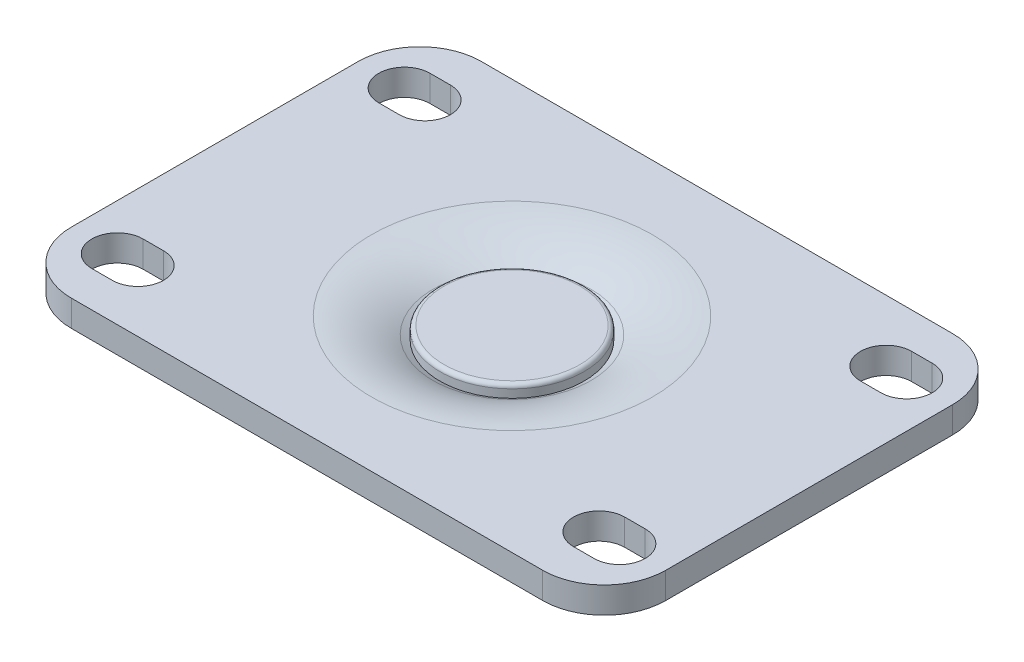
ISO-10303-21;
HEADER;
FILE_DESCRIPTION(('STEP AP214'),'2;1');
FILE_NAME('part.step','',(''),(''),'','','');
FILE_SCHEMA(('AUTOMOTIVE_DESIGN { 1 0 10303 214 1 1 1 1 }'));
ENDSEC;
DATA;
#1=APPLICATION_CONTEXT('core data for automotive mechanical design processes');
#2=APPLICATION_PROTOCOL_DEFINITION('international standard','automotive_design',2000,#1);
#3=PRODUCT_CONTEXT('',#1,'mechanical');
#4=PRODUCT('Part','Part','',(#3));
#5=PRODUCT_RELATED_PRODUCT_CATEGORY('part','',(#4));
#6=PRODUCT_DEFINITION_FORMATION('','',#4);
#7=PRODUCT_DEFINITION_CONTEXT('part definition',#1,'design');
#8=PRODUCT_DEFINITION('design','',#6,#7);
#9=PRODUCT_DEFINITION_SHAPE('','',#8);
#10=(LENGTH_UNIT() NAMED_UNIT(*) SI_UNIT(.MILLI.,.METRE.));
#11=(NAMED_UNIT(*) PLANE_ANGLE_UNIT() SI_UNIT($,.RADIAN.));
#12=(NAMED_UNIT(*) SI_UNIT($,.STERADIAN.) SOLID_ANGLE_UNIT());
#13=UNCERTAINTY_MEASURE_WITH_UNIT(LENGTH_MEASURE(1.E-05),#10,'distance_accuracy_value','');
#14=(GEOMETRIC_REPRESENTATION_CONTEXT(3) GLOBAL_UNCERTAINTY_ASSIGNED_CONTEXT((#13)) GLOBAL_UNIT_ASSIGNED_CONTEXT((#10,
#11,#12)) REPRESENTATION_CONTEXT('',''));
#15=CARTESIAN_POINT('',(0.,0.,0.));
#16=DIRECTION('',(0.,0.,1.));
#17=DIRECTION('',(1.,0.,0.));
#18=AXIS2_PLACEMENT_3D('',#15,#16,#17);
#19=CARTESIAN_POINT('',(0.,29.972,0.));
#20=DIRECTION('',(0.,-1.,0.));
#21=DIRECTION('',(0.,0.,-1.));
#22=AXIS2_PLACEMENT_3D('',#19,#20,#21);
#23=PLANE('',#22);
#24=CARTESIAN_POINT('',(0.,29.972,0.));
#25=DIRECTION('',(0.,-1.,0.));
#26=DIRECTION('',(0.,0.,-1.));
#27=AXIS2_PLACEMENT_3D('',#24,#25,#26);
#28=CIRCLE('',#27,7.747);
#29=CARTESIAN_POINT('',(0.,29.972,-7.747));
#30=VERTEX_POINT('',#29);
#31=EDGE_CURVE('E863',#30,#30,#28,.T.);
#32=ORIENTED_EDGE('',*,*,#31,.T.);
#33=EDGE_LOOP('',(#32));
#34=FACE_BOUND('',#33,.T.);
#35=CARTESIAN_POINT('',(0.,29.972,0.));
#36=DIRECTION('',(0.,1.,0.));
#37=DIRECTION('',(0.,0.,-1.));
#38=AXIS2_PLACEMENT_3D('',#35,#36,#37);
#39=CIRCLE('',#38,10.5344886859688);
#40=CARTESIAN_POINT('',(0.,29.972,-10.5344886859688));
#41=VERTEX_POINT('',#40);
#42=EDGE_CURVE('E907',#41,#41,#39,.T.);
#43=ORIENTED_EDGE('',*,*,#42,.T.);
#44=EDGE_LOOP('',(#43));
#45=FACE_BOUND('',#44,.T.);
#46=ADVANCED_FACE('F49',(#34,#45),#23,.F.);
#47=CARTESIAN_POINT('',(0.,27.051,0.));
#48=DIRECTION('',(0.,-1.,0.));
#49=DIRECTION('',(0.,0.,-1.));
#50=AXIS2_PLACEMENT_3D('',#47,#48,#49);
#51=PLANE('',#50);
#52=CARTESIAN_POINT('',(0.,27.051,0.));
#53=DIRECTION('',(0.,-1.,0.));
#54=DIRECTION('',(0.,0.,-1.));
#55=AXIS2_PLACEMENT_3D('',#52,#53,#54);
#56=CIRCLE('',#55,10.5344886859688);
#57=CARTESIAN_POINT('',(0.,27.051,-10.5344886859688));
#58=VERTEX_POINT('',#57);
#59=EDGE_CURVE('E970',#58,#58,#56,.T.);
#60=ORIENTED_EDGE('',*,*,#59,.T.);
#61=EDGE_LOOP('',(#60));
#62=FACE_BOUND('',#61,.T.);
#63=ADVANCED_FACE('F507',(#62),#51,.T.);
#64=CARTESIAN_POINT('',(0.,36.322,0.));
#65=DIRECTION('',(0.,-1.,0.));
#66=DIRECTION('',(0.,0.,-1.));
#67=AXIS2_PLACEMENT_3D('',#64,#65,#66);
#68=PLANE('',#67);
#69=CARTESIAN_POINT('',(0.,36.322,0.));
#70=DIRECTION('',(0.,-1.,0.));
#71=DIRECTION('',(0.,0.,-1.));
#72=AXIS2_PLACEMENT_3D('',#69,#70,#71);
#73=CIRCLE('',#72,7.747);
#74=CARTESIAN_POINT('',(0.,36.322,-7.747));
#75=VERTEX_POINT('',#74);
#76=EDGE_CURVE('E976',#75,#75,#73,.T.);
#77=ORIENTED_EDGE('',*,*,#76,.F.);
#78=EDGE_LOOP('',(#77));
#79=FACE_BOUND('',#78,.T.);
#80=CARTESIAN_POINT('',(0.,36.322,0.));
#81=DIRECTION('',(0.,-1.,0.));
#82=DIRECTION('',(0.,0.,-1.));
#83=AXIS2_PLACEMENT_3D('',#80,#81,#82);
#84=CIRCLE('',#83,11.1694886859688);
#85=CARTESIAN_POINT('',(0.,36.322,-11.1694886859688));
#86=VERTEX_POINT('',#85);
#87=EDGE_CURVE('E858',#86,#86,#84,.T.);
#88=ORIENTED_EDGE('',*,*,#87,.T.);
#89=EDGE_LOOP('',(#88));
#90=FACE_BOUND('',#89,.T.);
#91=ADVANCED_FACE('F511',(#79,#90),#68,.T.);
#92=CARTESIAN_POINT('',(0.,48.006,0.));
#93=DIRECTION('',(0.,-1.,0.));
#94=DIRECTION('',(0.,0.,-1.));
#95=AXIS2_PLACEMENT_3D('',#92,#93,#94);
#96=PLANE('',#95);
#97=CARTESIAN_POINT('',(0.,48.006,0.));
#98=DIRECTION('',(0.,1.,0.));
#99=DIRECTION('',(0.,0.,-1.));
#100=AXIS2_PLACEMENT_3D('',#97,#98,#99);
#101=CIRCLE('',#100,10.5344886859688);
#102=CARTESIAN_POINT('',(0.,48.006,-10.5344886859688));
#103=VERTEX_POINT('',#102);
#104=EDGE_CURVE('E960',#103,#103,#101,.T.);
#105=ORIENTED_EDGE('',*,*,#104,.T.);
#106=EDGE_LOOP('',(#105));
#107=FACE_BOUND('',#106,.T.);
#108=ADVANCED_FACE('F635',(#107),#96,.F.);
#109=CARTESIAN_POINT('',(-36.5125,49.276,22.225));
#110=DIRECTION('',(0.,-1.,0.));
#111=DIRECTION('',(0.,0.,-1.));
#112=AXIS2_PLACEMENT_3D('',#109,#110,#111);
#113=CYLINDRICAL_SURFACE('',#112,9.525);
#114=CARTESIAN_POINT('',(-36.5125,49.276,22.225));
#115=DIRECTION('',(0.,1.,0.));
#116=DIRECTION('',(0.,0.,-1.));
#117=AXIS2_PLACEMENT_3D('',#114,#115,#116);
#118=CIRCLE('',#117,9.525);
#119=CARTESIAN_POINT('',(-46.0375,49.276,22.225));
#120=VERTEX_POINT('',#119);
#121=CARTESIAN_POINT('',(-36.5125,49.276,31.75));
#122=VERTEX_POINT('',#121);
#123=EDGE_CURVE('E330',#120,#122,#118,.T.);
#124=ORIENTED_EDGE('',*,*,#123,.F.);
#125=DIRECTION('',(0.,1.,0.));
#126=VECTOR('',#125,1.);
#127=CARTESIAN_POINT('',(-46.0375,49.276,22.225));
#128=LINE('',#127,#126);
#129=CARTESIAN_POINT('',(-46.0375,45.212,22.225));
#130=VERTEX_POINT('',#129);
#131=EDGE_CURVE('E347',#130,#120,#128,.T.);
#132=ORIENTED_EDGE('',*,*,#131,.F.);
#133=CARTESIAN_POINT('',(-36.5125,45.212,22.225));
#134=DIRECTION('',(0.,-1.,0.));
#135=DIRECTION('',(0.,0.,-1.));
#136=AXIS2_PLACEMENT_3D('',#133,#134,#135);
#137=CIRCLE('',#136,9.525);
#138=CARTESIAN_POINT('',(-36.5125,45.212,31.75));
#139=VERTEX_POINT('',#138);
#140=EDGE_CURVE('E390',#139,#130,#137,.T.);
#141=ORIENTED_EDGE('',*,*,#140,.F.);
#142=DIRECTION('',(0.,-1.,0.));
#143=VECTOR('',#142,1.);
#144=CARTESIAN_POINT('',(-36.5125,49.276,31.75));
#145=LINE('',#144,#143);
#146=EDGE_CURVE('E462',#122,#139,#145,.T.);
#147=ORIENTED_EDGE('',*,*,#146,.F.);
#148=EDGE_LOOP('',(#124,#132,#141,#147));
#149=FACE_BOUND('',#148,.T.);
#150=ADVANCED_FACE('F639',(#149),#113,.T.);
#151=CARTESIAN_POINT('',(-36.5125,49.276,-22.225));
#152=DIRECTION('',(0.,-1.,0.));
#153=DIRECTION('',(0.,0.,-1.));
#154=AXIS2_PLACEMENT_3D('',#151,#152,#153);
#155=CYLINDRICAL_SURFACE('',#154,9.525);
#156=CARTESIAN_POINT('',(-36.5125,49.276,-22.225));
#157=DIRECTION('',(0.,1.,0.));
#158=DIRECTION('',(0.,0.,-1.));
#159=AXIS2_PLACEMENT_3D('',#156,#157,#158);
#160=CIRCLE('',#159,9.525);
#161=CARTESIAN_POINT('',(-36.5125,49.276,-31.75));
#162=VERTEX_POINT('',#161);
#163=CARTESIAN_POINT('',(-46.0375,49.276,-22.225));
#164=VERTEX_POINT('',#163);
#165=EDGE_CURVE('E321',#162,#164,#160,.T.);
#166=ORIENTED_EDGE('',*,*,#165,.F.);
#167=DIRECTION('',(0.,1.,0.));
#168=VECTOR('',#167,1.);
#169=CARTESIAN_POINT('',(-36.5125,49.276,-31.75));
#170=LINE('',#169,#168);
#171=CARTESIAN_POINT('',(-36.5125,45.212,-31.75));
#172=VERTEX_POINT('',#171);
#173=EDGE_CURVE('E348',#172,#162,#170,.T.);
#174=ORIENTED_EDGE('',*,*,#173,.F.);
#175=CARTESIAN_POINT('',(-36.5125,45.212,-22.225));
#176=DIRECTION('',(0.,-1.,0.));
#177=DIRECTION('',(0.,0.,-1.));
#178=AXIS2_PLACEMENT_3D('',#175,#176,#177);
#179=CIRCLE('',#178,9.525);
#180=CARTESIAN_POINT('',(-46.0375,45.212,-22.225));
#181=VERTEX_POINT('',#180);
#182=EDGE_CURVE('E389',#181,#172,#179,.T.);
#183=ORIENTED_EDGE('',*,*,#182,.F.);
#184=DIRECTION('',(0.,-1.,0.));
#185=VECTOR('',#184,1.);
#186=CARTESIAN_POINT('',(-46.0375,49.276,-22.225));
#187=LINE('',#186,#185);
#188=EDGE_CURVE('E343',#164,#181,#187,.T.);
#189=ORIENTED_EDGE('',*,*,#188,.F.);
#190=EDGE_LOOP('',(#166,#174,#183,#189));
#191=FACE_BOUND('',#190,.T.);
#192=ADVANCED_FACE('F677',(#191),#155,.T.);
#193=CARTESIAN_POINT('',(36.5125,49.276,-22.225));
#194=DIRECTION('',(0.,-1.,0.));
#195=DIRECTION('',(0.,0.,-1.));
#196=AXIS2_PLACEMENT_3D('',#193,#194,#195);
#197=CYLINDRICAL_SURFACE('',#196,9.525);
#198=CARTESIAN_POINT('',(36.5125,49.276,-22.225));
#199=DIRECTION('',(0.,1.,0.));
#200=DIRECTION('',(0.,0.,-1.));
#201=AXIS2_PLACEMENT_3D('',#198,#199,#200);
#202=CIRCLE('',#201,9.525);
#203=CARTESIAN_POINT('',(46.0375,49.276,-22.225));
#204=VERTEX_POINT('',#203);
#205=CARTESIAN_POINT('',(36.5125,49.276,-31.75));
#206=VERTEX_POINT('',#205);
#207=EDGE_CURVE('E309',#204,#206,#202,.T.);
#208=ORIENTED_EDGE('',*,*,#207,.F.);
#209=DIRECTION('',(0.,1.,0.));
#210=VECTOR('',#209,1.);
#211=CARTESIAN_POINT('',(46.0375,49.276,-22.225));
#212=LINE('',#211,#210);
#213=CARTESIAN_POINT('',(46.0375,45.212,-22.225));
#214=VERTEX_POINT('',#213);
#215=EDGE_CURVE('E458',#214,#204,#212,.T.);
#216=ORIENTED_EDGE('',*,*,#215,.F.);
#217=CARTESIAN_POINT('',(36.5125,45.212,-22.225));
#218=DIRECTION('',(0.,-1.,0.));
#219=DIRECTION('',(0.,0.,-1.));
#220=AXIS2_PLACEMENT_3D('',#217,#218,#219);
#221=CIRCLE('',#220,9.525);
#222=CARTESIAN_POINT('',(36.5125,45.212,-31.75));
#223=VERTEX_POINT('',#222);
#224=EDGE_CURVE('E402',#223,#214,#221,.T.);
#225=ORIENTED_EDGE('',*,*,#224,.F.);
#226=DIRECTION('',(0.,-1.,0.));
#227=VECTOR('',#226,1.);
#228=CARTESIAN_POINT('',(36.5125,49.276,-31.75));
#229=LINE('',#228,#227);
#230=EDGE_CURVE('E465',#206,#223,#229,.T.);
#231=ORIENTED_EDGE('',*,*,#230,.F.);
#232=EDGE_LOOP('',(#208,#216,#225,#231));
#233=FACE_BOUND('',#232,.T.);
#234=ADVANCED_FACE('F672',(#233),#197,.T.);
#235=CARTESIAN_POINT('',(36.5125,49.276,22.225));
#236=DIRECTION('',(0.,-1.,0.));
#237=DIRECTION('',(0.,0.,-1.));
#238=AXIS2_PLACEMENT_3D('',#235,#236,#237);
#239=CYLINDRICAL_SURFACE('',#238,9.525);
#240=CARTESIAN_POINT('',(36.5125,49.276,22.225));
#241=DIRECTION('',(0.,1.,0.));
#242=DIRECTION('',(0.,0.,-1.));
#243=AXIS2_PLACEMENT_3D('',#240,#241,#242);
#244=CIRCLE('',#243,9.525);
#245=CARTESIAN_POINT('',(36.5125,49.276,31.75));
#246=VERTEX_POINT('',#245);
#247=CARTESIAN_POINT('',(46.0375,49.276,22.225));
#248=VERTEX_POINT('',#247);
#249=EDGE_CURVE('E286',#246,#248,#244,.T.);
#250=ORIENTED_EDGE('',*,*,#249,.F.);
#251=DIRECTION('',(0.,1.,0.));
#252=VECTOR('',#251,1.);
#253=CARTESIAN_POINT('',(36.5125,49.276,31.75));
#254=LINE('',#253,#252);
#255=CARTESIAN_POINT('',(36.5125,45.212,31.75));
#256=VERTEX_POINT('',#255);
#257=EDGE_CURVE('E459',#256,#246,#254,.T.);
#258=ORIENTED_EDGE('',*,*,#257,.F.);
#259=CARTESIAN_POINT('',(36.5125,45.212,22.225));
#260=DIRECTION('',(0.,-1.,0.));
#261=DIRECTION('',(0.,0.,-1.));
#262=AXIS2_PLACEMENT_3D('',#259,#260,#261);
#263=CIRCLE('',#262,9.525);
#264=CARTESIAN_POINT('',(46.0375,45.212,22.225));
#265=VERTEX_POINT('',#264);
#266=EDGE_CURVE('E299',#265,#256,#263,.T.);
#267=ORIENTED_EDGE('',*,*,#266,.F.);
#268=DIRECTION('',(0.,-1.,0.));
#269=VECTOR('',#268,1.);
#270=CARTESIAN_POINT('',(46.0375,49.276,22.225));
#271=LINE('',#270,#269);
#272=EDGE_CURVE('E450',#248,#265,#271,.T.);
#273=ORIENTED_EDGE('',*,*,#272,.F.);
#274=EDGE_LOOP('',(#250,#258,#267,#273));
#275=FACE_BOUND('',#274,.T.);
#276=ADVANCED_FACE('F676',(#275),#239,.T.);
#277=CARTESIAN_POINT('',(35.71875,49.276,18.25625));
#278=DIRECTION('',(0.,0.,1.));
#279=DIRECTION('',(1.,0.,0.));
#280=AXIS2_PLACEMENT_3D('',#277,#278,#279);
#281=PLANE('',#280);
#282=DIRECTION('',(-1.,0.,0.));
#283=VECTOR('',#282,1.);
#284=CARTESIAN_POINT('',(35.71875,45.212,18.25625));
#285=LINE('',#284,#283);
#286=CARTESIAN_POINT('',(38.89375,45.212,18.25625));
#287=VERTEX_POINT('',#286);
#288=CARTESIAN_POINT('',(35.71875,45.212,18.25625));
#289=VERTEX_POINT('',#288);
#290=EDGE_CURVE('E250',#287,#289,#285,.T.);
#291=ORIENTED_EDGE('',*,*,#290,.F.);
#292=DIRECTION('',(0.,-1.,0.));
#293=VECTOR('',#292,1.);
#294=CARTESIAN_POINT('',(38.89375,49.276,18.25625));
#295=LINE('',#294,#293);
#296=CARTESIAN_POINT('',(38.89375,49.276,18.25625));
#297=VERTEX_POINT('',#296);
#298=EDGE_CURVE('E11',#297,#287,#295,.T.);
#299=ORIENTED_EDGE('',*,*,#298,.F.);
#300=DIRECTION('',(-1.,0.,0.));
#301=VECTOR('',#300,1.);
#302=CARTESIAN_POINT('',(35.71875,49.276,18.25625));
#303=LINE('',#302,#301);
#304=CARTESIAN_POINT('',(35.71875,49.276,18.25625));
#305=VERTEX_POINT('',#304);
#306=EDGE_CURVE('E252',#297,#305,#303,.T.);
#307=ORIENTED_EDGE('',*,*,#306,.T.);
#308=DIRECTION('',(0.,-1.,0.));
#309=VECTOR('',#308,1.);
#310=CARTESIAN_POINT('',(35.71875,49.276,18.25625));
#311=LINE('',#310,#309);
#312=EDGE_CURVE('E246',#305,#289,#311,.T.);
#313=ORIENTED_EDGE('',*,*,#312,.T.);
#314=EDGE_LOOP('',(#291,#299,#307,#313));
#315=FACE_BOUND('',#314,.T.);
#316=ADVANCED_FACE('F248',(#315),#281,.T.);
#317=CARTESIAN_POINT('',(38.89375,49.276,22.225));
#318=DIRECTION('',(0.,-1.,0.));
#319=DIRECTION('',(0.,0.,-1.));
#320=AXIS2_PLACEMENT_3D('',#317,#318,#319);
#321=CYLINDRICAL_SURFACE('',#320,3.96875);
#322=CARTESIAN_POINT('',(38.89375,45.212,22.225));
#323=DIRECTION('',(0.,1.,0.));
#324=DIRECTION('',(0.,0.,1.));
#325=AXIS2_PLACEMENT_3D('',#322,#323,#324);
#326=CIRCLE('',#325,3.96875);
#327=CARTESIAN_POINT('',(38.89375,45.212,26.19375));
#328=VERTEX_POINT('',#327);
#329=EDGE_CURVE('E271',#328,#287,#326,.T.);
#330=ORIENTED_EDGE('',*,*,#329,.F.);
#331=DIRECTION('',(0.,-1.,0.));
#332=VECTOR('',#331,1.);
#333=CARTESIAN_POINT('',(38.89375,49.276,26.19375));
#334=LINE('',#333,#332);
#335=CARTESIAN_POINT('',(38.89375,49.276,26.19375));
#336=VERTEX_POINT('',#335);
#337=EDGE_CURVE('E58',#336,#328,#334,.T.);
#338=ORIENTED_EDGE('',*,*,#337,.F.);
#339=CARTESIAN_POINT('',(38.89375,49.276,22.225));
#340=DIRECTION('',(0.,1.,0.));
#341=DIRECTION('',(0.,0.,1.));
#342=AXIS2_PLACEMENT_3D('',#339,#340,#341);
#343=CIRCLE('',#342,3.96875);
#344=EDGE_CURVE('E305',#336,#297,#343,.T.);
#345=ORIENTED_EDGE('',*,*,#344,.T.);
#346=ORIENTED_EDGE('',*,*,#298,.T.);
#347=EDGE_LOOP('',(#330,#338,#345,#346));
#348=FACE_BOUND('',#347,.T.);
#349=ADVANCED_FACE('F491',(#348),#321,.F.);
#350=CARTESIAN_POINT('',(35.71875,49.276,26.19375));
#351=DIRECTION('',(0.,0.,-1.));
#352=DIRECTION('',(0.,-1.,0.));
#353=AXIS2_PLACEMENT_3D('',#350,#351,#352);
#354=PLANE('',#353);
#355=DIRECTION('',(1.,0.,0.));
#356=VECTOR('',#355,1.);
#357=CARTESIAN_POINT('',(35.71875,45.212,26.19375));
#358=LINE('',#357,#356);
#359=CARTESIAN_POINT('',(35.71875,45.212,26.19375));
#360=VERTEX_POINT('',#359);
#361=EDGE_CURVE('E266',#360,#328,#358,.T.);
#362=ORIENTED_EDGE('',*,*,#361,.F.);
#363=DIRECTION('',(0.,-1.,0.));
#364=VECTOR('',#363,1.);
#365=CARTESIAN_POINT('',(35.71875,49.276,26.19375));
#366=LINE('',#365,#364);
#367=CARTESIAN_POINT('',(35.71875,49.276,26.19375));
#368=VERTEX_POINT('',#367);
#369=EDGE_CURVE('E257',#368,#360,#366,.T.);
#370=ORIENTED_EDGE('',*,*,#369,.F.);
#371=DIRECTION('',(1.,0.,0.));
#372=VECTOR('',#371,1.);
#373=CARTESIAN_POINT('',(35.71875,49.276,26.19375));
#374=LINE('',#373,#372);
#375=EDGE_CURVE('E301',#368,#336,#374,.T.);
#376=ORIENTED_EDGE('',*,*,#375,.T.);
#377=ORIENTED_EDGE('',*,*,#337,.T.);
#378=EDGE_LOOP('',(#362,#370,#376,#377));
#379=FACE_BOUND('',#378,.T.);
#380=ADVANCED_FACE('F486',(#379),#354,.T.);
#381=CARTESIAN_POINT('',(35.71875,49.276,22.225));
#382=DIRECTION('',(0.,-1.,0.));
#383=DIRECTION('',(0.,0.,-1.));
#384=AXIS2_PLACEMENT_3D('',#381,#382,#383);
#385=CYLINDRICAL_SURFACE('',#384,3.96875);
#386=CARTESIAN_POINT('',(35.71875,45.212,22.225));
#387=DIRECTION('',(0.,1.,0.));
#388=DIRECTION('',(0.,0.,1.));
#389=AXIS2_PLACEMENT_3D('',#386,#387,#388);
#390=CIRCLE('',#389,3.96875);
#391=EDGE_CURVE('E261',#289,#360,#390,.T.);
#392=ORIENTED_EDGE('',*,*,#391,.F.);
#393=ORIENTED_EDGE('',*,*,#312,.F.);
#394=CARTESIAN_POINT('',(35.71875,49.276,22.225));
#395=DIRECTION('',(0.,1.,0.));
#396=DIRECTION('',(0.,0.,1.));
#397=AXIS2_PLACEMENT_3D('',#394,#395,#396);
#398=CIRCLE('',#397,3.96875);
#399=EDGE_CURVE('E326',#305,#368,#398,.T.);
#400=ORIENTED_EDGE('',*,*,#399,.T.);
#401=ORIENTED_EDGE('',*,*,#369,.T.);
#402=EDGE_LOOP('',(#392,#393,#400,#401));
#403=FACE_BOUND('',#402,.T.);
#404=ADVANCED_FACE('F262',(#403),#385,.F.);
#405=CARTESIAN_POINT('',(-38.89375,49.276,18.25625));
#406=DIRECTION('',(0.,0.,1.));
#407=DIRECTION('',(1.,0.,0.));
#408=AXIS2_PLACEMENT_3D('',#405,#406,#407);
#409=PLANE('',#408);
#410=DIRECTION('',(-1.,0.,0.));
#411=VECTOR('',#410,1.);
#412=CARTESIAN_POINT('',(-38.89375,45.212,18.25625));
#413=LINE('',#412,#411);
#414=CARTESIAN_POINT('',(-35.71875,45.212,18.25625));
#415=VERTEX_POINT('',#414);
#416=CARTESIAN_POINT('',(-38.89375,45.212,18.25625));
#417=VERTEX_POINT('',#416);
#418=EDGE_CURVE('E438',#415,#417,#413,.T.);
#419=ORIENTED_EDGE('',*,*,#418,.F.);
#420=DIRECTION('',(0.,-1.,0.));
#421=VECTOR('',#420,1.);
#422=CARTESIAN_POINT('',(-35.71875,49.276,18.25625));
#423=LINE('',#422,#421);
#424=CARTESIAN_POINT('',(-35.71875,49.276,18.25625));
#425=VERTEX_POINT('',#424);
#426=EDGE_CURVE('E258',#425,#415,#423,.T.);
#427=ORIENTED_EDGE('',*,*,#426,.F.);
#428=DIRECTION('',(-1.,0.,0.));
#429=VECTOR('',#428,1.);
#430=CARTESIAN_POINT('',(-38.89375,49.276,18.25625));
#431=LINE('',#430,#429);
#432=CARTESIAN_POINT('',(-38.89375,49.276,18.25625));
#433=VERTEX_POINT('',#432);
#434=EDGE_CURVE('E360',#425,#433,#431,.T.);
#435=ORIENTED_EDGE('',*,*,#434,.T.);
#436=DIRECTION('',(0.,-1.,0.));
#437=VECTOR('',#436,1.);
#438=CARTESIAN_POINT('',(-38.89375,49.276,18.25625));
#439=LINE('',#438,#437);
#440=EDGE_CURVE('E428',#433,#417,#439,.T.);
#441=ORIENTED_EDGE('',*,*,#440,.T.);
#442=EDGE_LOOP('',(#419,#427,#435,#441));
#443=FACE_BOUND('',#442,.T.);
#444=ADVANCED_FACE('F755',(#443),#409,.T.);
#445=CARTESIAN_POINT('',(-35.71875,49.276,22.225));
#446=DIRECTION('',(0.,-1.,0.));
#447=DIRECTION('',(0.,0.,-1.));
#448=AXIS2_PLACEMENT_3D('',#445,#446,#447);
#449=CYLINDRICAL_SURFACE('',#448,3.96875);
#450=CARTESIAN_POINT('',(-35.71875,45.212,22.225));
#451=DIRECTION('',(0.,1.,0.));
#452=DIRECTION('',(0.,0.,1.));
#453=AXIS2_PLACEMENT_3D('',#450,#451,#452);
#454=CIRCLE('',#453,3.96875);
#455=CARTESIAN_POINT('',(-35.71875,45.212,26.19375));
#456=VERTEX_POINT('',#455);
#457=EDGE_CURVE('E273',#456,#415,#454,.T.);
#458=ORIENTED_EDGE('',*,*,#457,.F.);
#459=DIRECTION('',(0.,-1.,0.));
#460=VECTOR('',#459,1.);
#461=CARTESIAN_POINT('',(-35.71875,49.276,26.19375));
#462=LINE('',#461,#460);
#463=CARTESIAN_POINT('',(-35.71875,49.276,26.19375));
#464=VERTEX_POINT('',#463);
#465=EDGE_CURVE('E427',#464,#456,#462,.T.);
#466=ORIENTED_EDGE('',*,*,#465,.F.);
#467=CARTESIAN_POINT('',(-35.71875,49.276,22.225));
#468=DIRECTION('',(0.,1.,0.));
#469=DIRECTION('',(0.,0.,1.));
#470=AXIS2_PLACEMENT_3D('',#467,#468,#469);
#471=CIRCLE('',#470,3.96875);
#472=EDGE_CURVE('E364',#464,#425,#471,.T.);
#473=ORIENTED_EDGE('',*,*,#472,.T.);
#474=ORIENTED_EDGE('',*,*,#426,.T.);
#475=EDGE_LOOP('',(#458,#466,#473,#474));
#476=FACE_BOUND('',#475,.T.);
#477=ADVANCED_FACE('F746',(#476),#449,.F.);
#478=CARTESIAN_POINT('',(-38.89375,49.276,26.19375));
#479=DIRECTION('',(0.,0.,-1.));
#480=DIRECTION('',(0.,-1.,0.));
#481=AXIS2_PLACEMENT_3D('',#478,#479,#480);
#482=PLANE('',#481);
#483=DIRECTION('',(1.,0.,0.));
#484=VECTOR('',#483,1.);
#485=CARTESIAN_POINT('',(-38.89375,45.212,26.19375));
#486=LINE('',#485,#484);
#487=CARTESIAN_POINT('',(-38.89375,45.212,26.19375));
#488=VERTEX_POINT('',#487);
#489=EDGE_CURVE('E280',#488,#456,#486,.T.);
#490=ORIENTED_EDGE('',*,*,#489,.F.);
#491=DIRECTION('',(0.,-1.,0.));
#492=VECTOR('',#491,1.);
#493=CARTESIAN_POINT('',(-38.89375,49.276,26.19375));
#494=LINE('',#493,#492);
#495=CARTESIAN_POINT('',(-38.89375,49.276,26.19375));
#496=VERTEX_POINT('',#495);
#497=EDGE_CURVE('E424',#496,#488,#494,.T.);
#498=ORIENTED_EDGE('',*,*,#497,.F.);
#499=DIRECTION('',(1.,0.,0.));
#500=VECTOR('',#499,1.);
#501=CARTESIAN_POINT('',(-38.89375,49.276,26.19375));
#502=LINE('',#501,#500);
#503=EDGE_CURVE('E368',#496,#464,#502,.T.);
#504=ORIENTED_EDGE('',*,*,#503,.T.);
#505=ORIENTED_EDGE('',*,*,#465,.T.);
#506=EDGE_LOOP('',(#490,#498,#504,#505));
#507=FACE_BOUND('',#506,.T.);
#508=ADVANCED_FACE('F737',(#507),#482,.T.);
#509=CARTESIAN_POINT('',(-38.89375,49.276,22.225));
#510=DIRECTION('',(0.,-1.,0.));
#511=DIRECTION('',(0.,0.,-1.));
#512=AXIS2_PLACEMENT_3D('',#509,#510,#511);
#513=CYLINDRICAL_SURFACE('',#512,3.96875);
#514=CARTESIAN_POINT('',(-38.89375,45.212,22.225));
#515=DIRECTION('',(0.,1.,0.));
#516=DIRECTION('',(0.,0.,1.));
#517=AXIS2_PLACEMENT_3D('',#514,#515,#516);
#518=CIRCLE('',#517,3.96875);
#519=EDGE_CURVE('E443',#417,#488,#518,.T.);
#520=ORIENTED_EDGE('',*,*,#519,.F.);
#521=ORIENTED_EDGE('',*,*,#440,.F.);
#522=CARTESIAN_POINT('',(-38.89375,49.276,22.225));
#523=DIRECTION('',(0.,1.,0.));
#524=DIRECTION('',(0.,0.,1.));
#525=AXIS2_PLACEMENT_3D('',#522,#523,#524);
#526=CIRCLE('',#525,3.96875);
#527=EDGE_CURVE('E304',#433,#496,#526,.T.);
#528=ORIENTED_EDGE('',*,*,#527,.T.);
#529=ORIENTED_EDGE('',*,*,#497,.T.);
#530=EDGE_LOOP('',(#520,#521,#528,#529));
#531=FACE_BOUND('',#530,.T.);
#532=ADVANCED_FACE('F728',(#531),#513,.F.);
#533=CARTESIAN_POINT('',(-38.89375,49.276,-26.19375));
#534=DIRECTION('',(0.,0.,1.));
#535=DIRECTION('',(1.,0.,0.));
#536=AXIS2_PLACEMENT_3D('',#533,#534,#535);
#537=PLANE('',#536);
#538=DIRECTION('',(-1.,0.,0.));
#539=VECTOR('',#538,1.);
#540=CARTESIAN_POINT('',(-38.89375,45.212,-26.19375));
#541=LINE('',#540,#539);
#542=CARTESIAN_POINT('',(-35.71875,45.212,-26.19375));
#543=VERTEX_POINT('',#542);
#544=CARTESIAN_POINT('',(-38.89375,45.212,-26.19375));
#545=VERTEX_POINT('',#544);
#546=EDGE_CURVE('E423',#543,#545,#541,.T.);
#547=ORIENTED_EDGE('',*,*,#546,.F.);
#548=DIRECTION('',(0.,-1.,0.));
#549=VECTOR('',#548,1.);
#550=CARTESIAN_POINT('',(-35.71875,49.276,-26.19375));
#551=LINE('',#550,#549);
#552=CARTESIAN_POINT('',(-35.71875,49.276,-26.19375));
#553=VERTEX_POINT('',#552);
#554=EDGE_CURVE('E454',#553,#543,#551,.T.);
#555=ORIENTED_EDGE('',*,*,#554,.F.);
#556=DIRECTION('',(-1.,0.,0.));
#557=VECTOR('',#556,1.);
#558=CARTESIAN_POINT('',(-38.89375,49.276,-26.19375));
#559=LINE('',#558,#557);
#560=CARTESIAN_POINT('',(-38.89375,49.276,-26.19375));
#561=VERTEX_POINT('',#560);
#562=EDGE_CURVE('E338',#553,#561,#559,.T.);
#563=ORIENTED_EDGE('',*,*,#562,.T.);
#564=DIRECTION('',(0.,-1.,0.));
#565=VECTOR('',#564,1.);
#566=CARTESIAN_POINT('',(-38.89375,49.276,-26.19375));
#567=LINE('',#566,#565);
#568=EDGE_CURVE('E293',#561,#545,#567,.T.);
#569=ORIENTED_EDGE('',*,*,#568,.T.);
#570=EDGE_LOOP('',(#547,#555,#563,#569));
#571=FACE_BOUND('',#570,.T.);
#572=ADVANCED_FACE('F604',(#571),#537,.T.);
#573=CARTESIAN_POINT('',(-35.71875,49.276,-22.225));
#574=DIRECTION('',(0.,-1.,0.));
#575=DIRECTION('',(0.,0.,-1.));
#576=AXIS2_PLACEMENT_3D('',#573,#574,#575);
#577=CYLINDRICAL_SURFACE('',#576,3.96875);
#578=CARTESIAN_POINT('',(-35.71875,45.212,-22.225));
#579=DIRECTION('',(0.,1.,0.));
#580=DIRECTION('',(0.,0.,1.));
#581=AXIS2_PLACEMENT_3D('',#578,#579,#580);
#582=CIRCLE('',#581,3.96875);
#583=CARTESIAN_POINT('',(-35.71875,45.212,-18.25625));
#584=VERTEX_POINT('',#583);
#585=EDGE_CURVE('E417',#584,#543,#582,.T.);
#586=ORIENTED_EDGE('',*,*,#585,.F.);
#587=DIRECTION('',(0.,-1.,0.));
#588=VECTOR('',#587,1.);
#589=CARTESIAN_POINT('',(-35.71875,49.276,-18.25625));
#590=LINE('',#589,#588);
#591=CARTESIAN_POINT('',(-35.71875,49.276,-18.25625));
#592=VERTEX_POINT('',#591);
#593=EDGE_CURVE('E451',#592,#584,#590,.T.);
#594=ORIENTED_EDGE('',*,*,#593,.F.);
#595=CARTESIAN_POINT('',(-35.71875,49.276,-22.225));
#596=DIRECTION('',(0.,1.,0.));
#597=DIRECTION('',(0.,0.,1.));
#598=AXIS2_PLACEMENT_3D('',#595,#596,#597);
#599=CIRCLE('',#598,3.96875);
#600=EDGE_CURVE('E342',#592,#553,#599,.T.);
#601=ORIENTED_EDGE('',*,*,#600,.T.);
#602=ORIENTED_EDGE('',*,*,#554,.T.);
#603=EDGE_LOOP('',(#586,#594,#601,#602));
#604=FACE_BOUND('',#603,.T.);
#605=ADVANCED_FACE('F599',(#604),#577,.F.);
#606=CARTESIAN_POINT('',(-38.89375,49.276,-18.25625));
#607=DIRECTION('',(0.,0.,-1.));
#608=DIRECTION('',(0.,-1.,0.));
#609=AXIS2_PLACEMENT_3D('',#606,#607,#608);
#610=PLANE('',#609);
#611=DIRECTION('',(1.,0.,0.));
#612=VECTOR('',#611,1.);
#613=CARTESIAN_POINT('',(-38.89375,45.212,-18.25625));
#614=LINE('',#613,#612);
#615=CARTESIAN_POINT('',(-38.89375,45.212,-18.25625));
#616=VERTEX_POINT('',#615);
#617=EDGE_CURVE('E413',#616,#584,#614,.T.);
#618=ORIENTED_EDGE('',*,*,#617,.F.);
#619=DIRECTION('',(0.,-1.,0.));
#620=VECTOR('',#619,1.);
#621=CARTESIAN_POINT('',(-38.89375,49.276,-18.25625));
#622=LINE('',#621,#620);
#623=CARTESIAN_POINT('',(-38.89375,49.276,-18.25625));
#624=VERTEX_POINT('',#623);
#625=EDGE_CURVE('E455',#624,#616,#622,.T.);
#626=ORIENTED_EDGE('',*,*,#625,.F.);
#627=DIRECTION('',(1.,0.,0.));
#628=VECTOR('',#627,1.);
#629=CARTESIAN_POINT('',(-38.89375,49.276,-18.25625));
#630=LINE('',#629,#628);
#631=EDGE_CURVE('E329',#624,#592,#630,.T.);
#632=ORIENTED_EDGE('',*,*,#631,.T.);
#633=ORIENTED_EDGE('',*,*,#593,.T.);
#634=EDGE_LOOP('',(#618,#626,#632,#633));
#635=FACE_BOUND('',#634,.T.);
#636=ADVANCED_FACE('F603',(#635),#610,.T.);
#637=CARTESIAN_POINT('',(-38.89375,49.276,-22.225));
#638=DIRECTION('',(0.,-1.,0.));
#639=DIRECTION('',(0.,0.,-1.));
#640=AXIS2_PLACEMENT_3D('',#637,#638,#639);
#641=CYLINDRICAL_SURFACE('',#640,3.96875);
#642=CARTESIAN_POINT('',(-38.89375,45.212,-22.225));
#643=DIRECTION('',(0.,1.,0.));
#644=DIRECTION('',(0.,0.,1.));
#645=AXIS2_PLACEMENT_3D('',#642,#643,#644);
#646=CIRCLE('',#645,3.96875);
#647=EDGE_CURVE('E418',#545,#616,#646,.T.);
#648=ORIENTED_EDGE('',*,*,#647,.F.);
#649=ORIENTED_EDGE('',*,*,#568,.F.);
#650=CARTESIAN_POINT('',(-38.89375,49.276,-22.225));
#651=DIRECTION('',(0.,1.,0.));
#652=DIRECTION('',(0.,0.,1.));
#653=AXIS2_PLACEMENT_3D('',#650,#651,#652);
#654=CIRCLE('',#653,3.96875);
#655=EDGE_CURVE('E334',#561,#624,#654,.T.);
#656=ORIENTED_EDGE('',*,*,#655,.T.);
#657=ORIENTED_EDGE('',*,*,#625,.T.);
#658=EDGE_LOOP('',(#648,#649,#656,#657));
#659=FACE_BOUND('',#658,.T.);
#660=ADVANCED_FACE('F653',(#659),#641,.F.);
#661=CARTESIAN_POINT('',(35.71875,49.276,-26.19375));
#662=DIRECTION('',(0.,0.,1.));
#663=DIRECTION('',(1.,0.,0.));
#664=AXIS2_PLACEMENT_3D('',#661,#662,#663);
#665=PLANE('',#664);
#666=DIRECTION('',(-1.,0.,0.));
#667=VECTOR('',#666,1.);
#668=CARTESIAN_POINT('',(35.71875,45.212,-26.19375));
#669=LINE('',#668,#667);
#670=CARTESIAN_POINT('',(38.89375,45.212,-26.19375));
#671=VERTEX_POINT('',#670);
#672=CARTESIAN_POINT('',(35.71875,45.212,-26.19375));
#673=VERTEX_POINT('',#672);
#674=EDGE_CURVE('E397',#671,#673,#669,.T.);
#675=ORIENTED_EDGE('',*,*,#674,.F.);
#676=DIRECTION('',(0.,-1.,0.));
#677=VECTOR('',#676,1.);
#678=CARTESIAN_POINT('',(38.89375,49.276,-26.19375));
#679=LINE('',#678,#677);
#680=CARTESIAN_POINT('',(38.89375,49.276,-26.19375));
#681=VERTEX_POINT('',#680);
#682=EDGE_CURVE('E290',#681,#671,#679,.T.);
#683=ORIENTED_EDGE('',*,*,#682,.F.);
#684=DIRECTION('',(-1.,0.,0.));
#685=VECTOR('',#684,1.);
#686=CARTESIAN_POINT('',(35.71875,49.276,-26.19375));
#687=LINE('',#686,#685);
#688=CARTESIAN_POINT('',(35.71875,49.276,-26.19375));
#689=VERTEX_POINT('',#688);
#690=EDGE_CURVE('E373',#681,#689,#687,.T.);
#691=ORIENTED_EDGE('',*,*,#690,.T.);
#692=DIRECTION('',(0.,-1.,0.));
#693=VECTOR('',#692,1.);
#694=CARTESIAN_POINT('',(35.71875,49.276,-26.19375));
#695=LINE('',#694,#693);
#696=EDGE_CURVE('E313',#689,#673,#695,.T.);
#697=ORIENTED_EDGE('',*,*,#696,.T.);
#698=EDGE_LOOP('',(#675,#683,#691,#697));
#699=FACE_BOUND('',#698,.T.);
#700=ADVANCED_FACE('F657',(#699),#665,.T.);
#701=CARTESIAN_POINT('',(38.89375,49.276,-22.225));
#702=DIRECTION('',(0.,-1.,0.));
#703=DIRECTION('',(0.,0.,-1.));
#704=AXIS2_PLACEMENT_3D('',#701,#702,#703);
#705=CYLINDRICAL_SURFACE('',#704,3.96875);
#706=CARTESIAN_POINT('',(38.89375,45.212,-22.225));
#707=DIRECTION('',(0.,1.,0.));
#708=DIRECTION('',(0.,0.,1.));
#709=AXIS2_PLACEMENT_3D('',#706,#707,#708);
#710=CIRCLE('',#709,3.96875);
#711=CARTESIAN_POINT('',(38.89375,45.212,-18.25625));
#712=VERTEX_POINT('',#711);
#713=EDGE_CURVE('E419',#712,#671,#710,.T.);
#714=ORIENTED_EDGE('',*,*,#713,.F.);
#715=DIRECTION('',(0.,-1.,0.));
#716=VECTOR('',#715,1.);
#717=CARTESIAN_POINT('',(38.89375,49.276,-18.25625));
#718=LINE('',#717,#716);
#719=CARTESIAN_POINT('',(38.89375,49.276,-18.25625));
#720=VERTEX_POINT('',#719);
#721=EDGE_CURVE('E294',#720,#712,#718,.T.);
#722=ORIENTED_EDGE('',*,*,#721,.F.);
#723=CARTESIAN_POINT('',(38.89375,49.276,-22.225));
#724=DIRECTION('',(0.,1.,0.));
#725=DIRECTION('',(0.,0.,1.));
#726=AXIS2_PLACEMENT_3D('',#723,#724,#725);
#727=CIRCLE('',#726,3.96875);
#728=EDGE_CURVE('E377',#720,#681,#727,.T.);
#729=ORIENTED_EDGE('',*,*,#728,.T.);
#730=ORIENTED_EDGE('',*,*,#682,.T.);
#731=EDGE_LOOP('',(#714,#722,#729,#730));
#732=FACE_BOUND('',#731,.T.);
#733=ADVANCED_FACE('F695',(#732),#705,.F.);
#734=CARTESIAN_POINT('',(35.71875,49.276,-18.25625));
#735=DIRECTION('',(0.,0.,-1.));
#736=DIRECTION('',(-1.,0.,0.));
#737=AXIS2_PLACEMENT_3D('',#734,#735,#736);
#738=PLANE('',#737);
#739=DIRECTION('',(1.,0.,0.));
#740=VECTOR('',#739,1.);
#741=CARTESIAN_POINT('',(35.71875,45.212,-18.25625));
#742=LINE('',#741,#740);
#743=CARTESIAN_POINT('',(35.71875,45.212,-18.25625));
#744=VERTEX_POINT('',#743);
#745=EDGE_CURVE('E412',#744,#712,#742,.T.);
#746=ORIENTED_EDGE('',*,*,#745,.F.);
#747=DIRECTION('',(0.,-1.,0.));
#748=VECTOR('',#747,1.);
#749=CARTESIAN_POINT('',(35.71875,49.276,-18.25625));
#750=LINE('',#749,#748);
#751=CARTESIAN_POINT('',(35.71875,49.276,-18.25625));
#752=VERTEX_POINT('',#751);
#753=EDGE_CURVE('E310',#752,#744,#750,.T.);
#754=ORIENTED_EDGE('',*,*,#753,.F.);
#755=DIRECTION('',(1.,0.,0.));
#756=VECTOR('',#755,1.);
#757=CARTESIAN_POINT('',(35.71875,49.276,-18.25625));
#758=LINE('',#757,#756);
#759=EDGE_CURVE('E300',#752,#720,#758,.T.);
#760=ORIENTED_EDGE('',*,*,#759,.T.);
#761=ORIENTED_EDGE('',*,*,#721,.T.);
#762=EDGE_LOOP('',(#746,#754,#760,#761));
#763=FACE_BOUND('',#762,.T.);
#764=ADVANCED_FACE('F686',(#763),#738,.T.);
#765=CARTESIAN_POINT('',(35.71875,49.276,-22.225));
#766=DIRECTION('',(0.,-1.,0.));
#767=DIRECTION('',(0.,0.,-1.));
#768=AXIS2_PLACEMENT_3D('',#765,#766,#767);
#769=CYLINDRICAL_SURFACE('',#768,3.96875);
#770=CARTESIAN_POINT('',(35.71875,45.212,-22.225));
#771=DIRECTION('',(0.,1.,0.));
#772=DIRECTION('',(0.,0.,1.));
#773=AXIS2_PLACEMENT_3D('',#770,#771,#772);
#774=CIRCLE('',#773,3.96875);
#775=EDGE_CURVE('E401',#673,#744,#774,.T.);
#776=ORIENTED_EDGE('',*,*,#775,.F.);
#777=ORIENTED_EDGE('',*,*,#696,.F.);
#778=CARTESIAN_POINT('',(35.71875,49.276,-22.225));
#779=DIRECTION('',(0.,1.,0.));
#780=DIRECTION('',(0.,0.,1.));
#781=AXIS2_PLACEMENT_3D('',#778,#779,#780);
#782=CIRCLE('',#781,3.96875);
#783=EDGE_CURVE('E369',#689,#752,#782,.T.);
#784=ORIENTED_EDGE('',*,*,#783,.T.);
#785=ORIENTED_EDGE('',*,*,#753,.T.);
#786=EDGE_LOOP('',(#776,#777,#784,#785));
#787=FACE_BOUND('',#786,.T.);
#788=ADVANCED_FACE('F666',(#787),#769,.F.);
#789=CARTESIAN_POINT('',(-46.0375,49.276,31.75));
#790=DIRECTION('',(0.,0.,-1.));
#791=DIRECTION('',(-1.,0.,0.));
#792=AXIS2_PLACEMENT_3D('',#789,#790,#791);
#793=PLANE('',#792);
#794=DIRECTION('',(1.,0.,0.));
#795=VECTOR('',#794,1.);
#796=CARTESIAN_POINT('',(-46.0375,45.212,31.75));
#797=LINE('',#796,#795);
#798=EDGE_CURVE('E384',#139,#256,#797,.T.);
#799=ORIENTED_EDGE('',*,*,#798,.T.);
#800=ORIENTED_EDGE('',*,*,#257,.T.);
#801=DIRECTION('',(1.,0.,0.));
#802=VECTOR('',#801,1.);
#803=CARTESIAN_POINT('',(-46.0375,49.276,31.75));
#804=LINE('',#803,#802);
#805=EDGE_CURVE('E284',#122,#246,#804,.T.);
#806=ORIENTED_EDGE('',*,*,#805,.F.);
#807=ORIENTED_EDGE('',*,*,#146,.T.);
#808=EDGE_LOOP('',(#799,#800,#806,#807));
#809=FACE_BOUND('',#808,.T.);
#810=ADVANCED_FACE('F501',(#809),#793,.F.);
#811=CARTESIAN_POINT('',(-46.0375,49.276,31.75));
#812=DIRECTION('',(1.,0.,0.));
#813=DIRECTION('',(0.,0.,-1.));
#814=AXIS2_PLACEMENT_3D('',#811,#812,#813);
#815=PLANE('',#814);
#816=DIRECTION('',(0.,0.,1.));
#817=VECTOR('',#816,1.);
#818=CARTESIAN_POINT('',(-46.0375,49.276,31.75));
#819=LINE('',#818,#817);
#820=EDGE_CURVE('E325',#164,#120,#819,.T.);
#821=ORIENTED_EDGE('',*,*,#820,.F.);
#822=ORIENTED_EDGE('',*,*,#188,.T.);
#823=DIRECTION('',(0.,0.,1.));
#824=VECTOR('',#823,1.);
#825=CARTESIAN_POINT('',(-46.0375,45.212,31.75));
#826=LINE('',#825,#824);
#827=EDGE_CURVE('E385',#181,#130,#826,.T.);
#828=ORIENTED_EDGE('',*,*,#827,.T.);
#829=ORIENTED_EDGE('',*,*,#131,.T.);
#830=EDGE_LOOP('',(#821,#822,#828,#829));
#831=FACE_BOUND('',#830,.T.);
#832=ADVANCED_FACE('F496',(#831),#815,.F.);
#833=CARTESIAN_POINT('',(-46.0375,49.276,-31.75));
#834=DIRECTION('',(0.,0.,1.));
#835=DIRECTION('',(1.,0.,0.));
#836=AXIS2_PLACEMENT_3D('',#833,#834,#835);
#837=PLANE('',#836);
#838=DIRECTION('',(-1.,0.,0.));
#839=VECTOR('',#838,1.);
#840=CARTESIAN_POINT('',(-46.0375,49.276,-31.75));
#841=LINE('',#840,#839);
#842=EDGE_CURVE('E317',#206,#162,#841,.T.);
#843=ORIENTED_EDGE('',*,*,#842,.F.);
#844=ORIENTED_EDGE('',*,*,#230,.T.);
#845=DIRECTION('',(-1.,0.,0.));
#846=VECTOR('',#845,1.);
#847=CARTESIAN_POINT('',(-46.0375,45.212,-31.75));
#848=LINE('',#847,#846);
#849=EDGE_CURVE('E396',#223,#172,#848,.T.);
#850=ORIENTED_EDGE('',*,*,#849,.T.);
#851=ORIENTED_EDGE('',*,*,#173,.T.);
#852=EDGE_LOOP('',(#843,#844,#850,#851));
#853=FACE_BOUND('',#852,.T.);
#854=ADVANCED_FACE('F500',(#853),#837,.F.);
#855=CARTESIAN_POINT('',(46.0375,49.276,31.75));
#856=DIRECTION('',(-1.,0.,0.));
#857=DIRECTION('',(0.,0.,1.));
#858=AXIS2_PLACEMENT_3D('',#855,#856,#857);
#859=PLANE('',#858);
#860=DIRECTION('',(0.,0.,-1.));
#861=VECTOR('',#860,1.);
#862=CARTESIAN_POINT('',(46.0375,49.276,31.75));
#863=LINE('',#862,#861);
#864=EDGE_CURVE('E289',#248,#204,#863,.T.);
#865=ORIENTED_EDGE('',*,*,#864,.F.);
#866=ORIENTED_EDGE('',*,*,#272,.T.);
#867=DIRECTION('',(0.,0.,-1.));
#868=VECTOR('',#867,1.);
#869=CARTESIAN_POINT('',(46.0375,45.212,31.75));
#870=LINE('',#869,#868);
#871=EDGE_CURVE('E295',#265,#214,#870,.T.);
#872=ORIENTED_EDGE('',*,*,#871,.T.);
#873=ORIENTED_EDGE('',*,*,#215,.T.);
#874=EDGE_LOOP('',(#865,#866,#872,#873));
#875=FACE_BOUND('',#874,.T.);
#876=ADVANCED_FACE('F559',(#875),#859,.F.);
#877=CARTESIAN_POINT('',(0.,45.212,0.));
#878=DIRECTION('',(0.,-1.,0.));
#879=DIRECTION('',(0.,0.,-1.));
#880=AXIS2_PLACEMENT_3D('',#877,#878,#879);
#881=PLANE('',#880);
#882=CARTESIAN_POINT('',(0.,45.212,0.));
#883=DIRECTION('',(0.,-1.,0.));
#884=DIRECTION('',(0.,0.,-1.));
#885=AXIS2_PLACEMENT_3D('',#882,#883,#884);
#886=CIRCLE('',#885,11.1694886859688);
#887=CARTESIAN_POINT('',(0.,45.212,-11.1694886859688));
#888=VERTEX_POINT('',#887);
#889=EDGE_CURVE('E862',#888,#888,#886,.T.);
#890=ORIENTED_EDGE('',*,*,#889,.F.);
#891=EDGE_LOOP('',(#890));
#892=FACE_BOUND('',#891,.T.);
#893=ORIENTED_EDGE('',*,*,#290,.T.);
#894=ORIENTED_EDGE('',*,*,#391,.T.);
#895=ORIENTED_EDGE('',*,*,#361,.T.);
#896=ORIENTED_EDGE('',*,*,#329,.T.);
#897=EDGE_LOOP('',(#893,#894,#895,#896));
#898=FACE_BOUND('',#897,.T.);
#899=ORIENTED_EDGE('',*,*,#418,.T.);
#900=ORIENTED_EDGE('',*,*,#519,.T.);
#901=ORIENTED_EDGE('',*,*,#489,.T.);
#902=ORIENTED_EDGE('',*,*,#457,.T.);
#903=EDGE_LOOP('',(#899,#900,#901,#902));
#904=FACE_BOUND('',#903,.T.);
#905=ORIENTED_EDGE('',*,*,#546,.T.);
#906=ORIENTED_EDGE('',*,*,#647,.T.);
#907=ORIENTED_EDGE('',*,*,#617,.T.);
#908=ORIENTED_EDGE('',*,*,#585,.T.);
#909=EDGE_LOOP('',(#905,#906,#907,#908));
#910=FACE_BOUND('',#909,.T.);
#911=ORIENTED_EDGE('',*,*,#674,.T.);
#912=ORIENTED_EDGE('',*,*,#775,.T.);
#913=ORIENTED_EDGE('',*,*,#745,.T.);
#914=ORIENTED_EDGE('',*,*,#713,.T.);
#915=EDGE_LOOP('',(#911,#912,#913,#914));
#916=FACE_BOUND('',#915,.T.);
#917=ORIENTED_EDGE('',*,*,#871,.F.);
#918=ORIENTED_EDGE('',*,*,#266,.T.);
#919=ORIENTED_EDGE('',*,*,#798,.F.);
#920=ORIENTED_EDGE('',*,*,#140,.T.);
#921=ORIENTED_EDGE('',*,*,#827,.F.);
#922=ORIENTED_EDGE('',*,*,#182,.T.);
#923=ORIENTED_EDGE('',*,*,#849,.F.);
#924=ORIENTED_EDGE('',*,*,#224,.T.);
#925=EDGE_LOOP('',(#917,#918,#919,#920,#921,#922,#923,#924));
#926=FACE_BOUND('',#925,.T.);
#927=ADVANCED_FACE('F269',(#892,#898,#904,#910,#916,#926),#881,.T.);
#928=CARTESIAN_POINT('',(0.,49.276,0.));
#929=DIRECTION('',(0.,-1.,0.));
#930=DIRECTION('',(0.,0.,-1.));
#931=AXIS2_PLACEMENT_3D('',#928,#929,#930);
#932=PLANE('',#931);
#933=ORIENTED_EDGE('',*,*,#783,.F.);
#934=ORIENTED_EDGE('',*,*,#690,.F.);
#935=ORIENTED_EDGE('',*,*,#728,.F.);
#936=ORIENTED_EDGE('',*,*,#759,.F.);
#937=EDGE_LOOP('',(#933,#934,#935,#936));
#938=FACE_BOUND('',#937,.T.);
#939=ORIENTED_EDGE('',*,*,#527,.F.);
#940=ORIENTED_EDGE('',*,*,#434,.F.);
#941=ORIENTED_EDGE('',*,*,#472,.F.);
#942=ORIENTED_EDGE('',*,*,#503,.F.);
#943=EDGE_LOOP('',(#939,#940,#941,#942));
#944=FACE_BOUND('',#943,.T.);
#945=CARTESIAN_POINT('',(0.,49.276,0.));
#946=DIRECTION('',(0.,-1.,0.));
#947=DIRECTION('',(0.,0.,-1.));
#948=AXIS2_PLACEMENT_3D('',#945,#946,#947);
#949=CIRCLE('',#948,21.7731821158129);
#950=CARTESIAN_POINT('',(0.,49.276,-21.7731821158129));
#951=VERTEX_POINT('',#950);
#952=EDGE_CURVE('E873',#951,#951,#949,.T.);
#953=ORIENTED_EDGE('',*,*,#952,.T.);
#954=EDGE_LOOP('',(#953));
#955=FACE_BOUND('',#954,.T.);
#956=ORIENTED_EDGE('',*,*,#399,.F.);
#957=ORIENTED_EDGE('',*,*,#306,.F.);
#958=ORIENTED_EDGE('',*,*,#344,.F.);
#959=ORIENTED_EDGE('',*,*,#375,.F.);
#960=EDGE_LOOP('',(#956,#957,#958,#959));
#961=FACE_BOUND('',#960,.T.);
#962=ORIENTED_EDGE('',*,*,#655,.F.);
#963=ORIENTED_EDGE('',*,*,#562,.F.);
#964=ORIENTED_EDGE('',*,*,#600,.F.);
#965=ORIENTED_EDGE('',*,*,#631,.F.);
#966=EDGE_LOOP('',(#962,#963,#964,#965));
#967=FACE_BOUND('',#966,.T.);
#968=ORIENTED_EDGE('',*,*,#805,.T.);
#969=ORIENTED_EDGE('',*,*,#249,.T.);
#970=ORIENTED_EDGE('',*,*,#864,.T.);
#971=ORIENTED_EDGE('',*,*,#207,.T.);
#972=ORIENTED_EDGE('',*,*,#842,.T.);
#973=ORIENTED_EDGE('',*,*,#165,.T.);
#974=ORIENTED_EDGE('',*,*,#820,.T.);
#975=ORIENTED_EDGE('',*,*,#123,.T.);
#976=EDGE_LOOP('',(#968,#969,#970,#971,#972,#973,#974,#975));
#977=FACE_BOUND('',#976,.T.);
#978=ADVANCED_FACE('F558',(#938,#944,#955,#961,#967,#977),#932,.F.);
#979=CARTESIAN_POINT('',(0.,49.276,0.));
#980=DIRECTION('',(0.,1.,0.));
#981=DIRECTION('',(0.,0.,1.));
#982=AXIS2_PLACEMENT_3D('',#979,#980,#981);
#983=CONICAL_SURFACE('',#982,16.66875,1.0471975511966);
#984=CARTESIAN_POINT('',(0.,46.7237839420936,0.));
#985=DIRECTION('',(0.,1.,0.));
#986=DIRECTION('',(0.,0.,-1.));
#987=AXIS2_PLACEMENT_3D('',#984,#985,#986);
#988=CIRCLE('',#987,12.2481821158129);
#989=CARTESIAN_POINT('',(0.,46.7237839420936,-12.2481821158129));
#990=VERTEX_POINT('',#989);
#991=EDGE_CURVE('E855',#990,#990,#988,.T.);
#992=ORIENTED_EDGE('',*,*,#991,.T.);
#993=EDGE_LOOP('',(#992));
#994=FACE_BOUND('',#993,.T.);
#995=CARTESIAN_POINT('',(0.,46.101,0.));
#996=DIRECTION('',(0.,1.,0.));
#997=DIRECTION('',(0.,0.,-1.));
#998=AXIS2_PLACEMENT_3D('',#995,#996,#997);
#999=CIRCLE('',#998,11.1694886859688);
#1000=CARTESIAN_POINT('',(0.,46.101,-11.1694886859688));
#1001=VERTEX_POINT('',#1000);
#1002=EDGE_CURVE('E869',#1001,#1001,#999,.T.);
#1003=ORIENTED_EDGE('',*,*,#1002,.F.);
#1004=EDGE_LOOP('',(#1003));
#1005=FACE_BOUND('',#1004,.T.);
#1006=ADVANCED_FACE('F613',(#994,#1005),#983,.F.);
#1007=CARTESIAN_POINT('',(0.,30.226,0.));
#1008=DIRECTION('',(0.,-1.,0.));
#1009=DIRECTION('',(0.,0.,-1.));
#1010=AXIS2_PLACEMENT_3D('',#1007,#1008,#1009);
#1011=TOROIDAL_SURFACE('',#1010,21.7731821158129,19.05);
#1012=ORIENTED_EDGE('',*,*,#991,.F.);
#1013=EDGE_LOOP('',(#1012));
#1014=FACE_BOUND('',#1013,.T.);
#1015=ORIENTED_EDGE('',*,*,#952,.F.);
#1016=EDGE_LOOP('',(#1015));
#1017=FACE_BOUND('',#1016,.T.);
#1018=ADVANCED_FACE('F577',(#1014,#1017),#1011,.T.);
#1019=CARTESIAN_POINT('',(0.,80.8680847689398,0.));
#1020=DIRECTION('',(0.,-1.,0.));
#1021=DIRECTION('',(0.,0.,-1.));
#1022=AXIS2_PLACEMENT_3D('',#1019,#1020,#1021);
#1023=CYLINDRICAL_SURFACE('',#1022,11.1694886859688);
#1024=CARTESIAN_POINT('',(0.,47.371,0.));
#1025=DIRECTION('',(0.,-1.,0.));
#1026=DIRECTION('',(0.,0.,-1.));
#1027=AXIS2_PLACEMENT_3D('',#1024,#1025,#1026);
#1028=CIRCLE('',#1027,11.1694886859688);
#1029=CARTESIAN_POINT('',(0.,47.371,-11.1694886859688));
#1030=VERTEX_POINT('',#1029);
#1031=EDGE_CURVE('E929',#1030,#1030,#1028,.T.);
#1032=ORIENTED_EDGE('',*,*,#1031,.T.);
#1033=EDGE_LOOP('',(#1032));
#1034=FACE_BOUND('',#1033,.T.);
#1035=ORIENTED_EDGE('',*,*,#1002,.T.);
#1036=EDGE_LOOP('',(#1035));
#1037=FACE_BOUND('',#1036,.T.);
#1038=ADVANCED_FACE('F568',(#1034,#1037),#1023,.T.);
#1039=CARTESIAN_POINT('',(0.,80.8680847689398,0.));
#1040=DIRECTION('',(0.,-1.,0.));
#1041=DIRECTION('',(0.,0.,-1.));
#1042=AXIS2_PLACEMENT_3D('',#1039,#1040,#1041);
#1043=CYLINDRICAL_SURFACE('',#1042,11.1694886859688);
#1044=ORIENTED_EDGE('',*,*,#889,.T.);
#1045=EDGE_LOOP('',(#1044));
#1046=FACE_BOUND('',#1045,.T.);
#1047=ORIENTED_EDGE('',*,*,#87,.F.);
#1048=EDGE_LOOP('',(#1047));
#1049=FACE_BOUND('',#1048,.T.);
#1050=ADVANCED_FACE('F541',(#1046,#1049),#1043,.T.);
#1051=CARTESIAN_POINT('',(0.,29.972,0.));
#1052=DIRECTION('',(0.,1.,0.));
#1053=DIRECTION('',(0.,0.,1.));
#1054=AXIS2_PLACEMENT_3D('',#1051,#1052,#1053);
#1055=CYLINDRICAL_SURFACE('',#1054,7.747);
#1056=ORIENTED_EDGE('',*,*,#31,.F.);
#1057=EDGE_LOOP('',(#1056));
#1058=FACE_BOUND('',#1057,.T.);
#1059=ORIENTED_EDGE('',*,*,#76,.T.);
#1060=EDGE_LOOP('',(#1059));
#1061=FACE_BOUND('',#1060,.T.);
#1062=ADVANCED_FACE('F536',(#1058,#1061),#1055,.T.);
#1063=CARTESIAN_POINT('',(0.,27.051,0.));
#1064=DIRECTION('',(0.,1.,0.));
#1065=DIRECTION('',(0.,0.,1.));
#1066=AXIS2_PLACEMENT_3D('',#1063,#1064,#1065);
#1067=CYLINDRICAL_SURFACE('',#1066,11.1694886859688);
#1068=CARTESIAN_POINT('',(0.,27.686,0.));
#1069=DIRECTION('',(0.,1.,0.));
#1070=DIRECTION('',(0.,0.,-1.));
#1071=AXIS2_PLACEMENT_3D('',#1068,#1069,#1070);
#1072=CIRCLE('',#1071,11.1694886859688);
#1073=CARTESIAN_POINT('',(0.,27.686,-11.1694886859688));
#1074=VERTEX_POINT('',#1073);
#1075=EDGE_CURVE('E963',#1074,#1074,#1072,.T.);
#1076=ORIENTED_EDGE('',*,*,#1075,.T.);
#1077=EDGE_LOOP('',(#1076));
#1078=FACE_BOUND('',#1077,.T.);
#1079=CARTESIAN_POINT('',(0.,29.337,0.));
#1080=DIRECTION('',(0.,-1.,0.));
#1081=DIRECTION('',(0.,0.,-1.));
#1082=AXIS2_PLACEMENT_3D('',#1079,#1080,#1081);
#1083=CIRCLE('',#1082,11.1694886859688);
#1084=CARTESIAN_POINT('',(0.,29.337,-11.1694886859688));
#1085=VERTEX_POINT('',#1084);
#1086=EDGE_CURVE('E956',#1085,#1085,#1083,.T.);
#1087=ORIENTED_EDGE('',*,*,#1086,.T.);
#1088=EDGE_LOOP('',(#1087));
#1089=FACE_BOUND('',#1088,.T.);
#1090=ADVANCED_FACE('F540',(#1078,#1089),#1067,.T.);
#1091=CARTESIAN_POINT('',(0.,47.371,0.));
#1092=DIRECTION('',(0.,-1.,0.));
#1093=DIRECTION('',(0.,0.,-1.));
#1094=AXIS2_PLACEMENT_3D('',#1091,#1092,#1093);
#1095=TOROIDAL_SURFACE('',#1094,10.5344886859688,0.635);
#1096=ORIENTED_EDGE('',*,*,#104,.F.);
#1097=EDGE_LOOP('',(#1096));
#1098=FACE_BOUND('',#1097,.T.);
#1099=ORIENTED_EDGE('',*,*,#1031,.F.);
#1100=EDGE_LOOP('',(#1099));
#1101=FACE_BOUND('',#1100,.T.);
#1102=ADVANCED_FACE('F522',(#1098,#1101),#1095,.T.);
#1103=CARTESIAN_POINT('',(0.,29.337,0.));
#1104=DIRECTION('',(0.,-1.,0.));
#1105=DIRECTION('',(0.,0.,-1.));
#1106=AXIS2_PLACEMENT_3D('',#1103,#1104,#1105);
#1107=TOROIDAL_SURFACE('',#1106,10.5344886859688,0.635);
#1108=ORIENTED_EDGE('',*,*,#42,.F.);
#1109=EDGE_LOOP('',(#1108));
#1110=FACE_BOUND('',#1109,.T.);
#1111=ORIENTED_EDGE('',*,*,#1086,.F.);
#1112=EDGE_LOOP('',(#1111));
#1113=FACE_BOUND('',#1112,.T.);
#1114=ADVANCED_FACE('F517',(#1110,#1113),#1107,.T.);
#1115=CARTESIAN_POINT('',(0.,27.686,0.));
#1116=DIRECTION('',(0.,-1.,0.));
#1117=DIRECTION('',(0.,0.,-1.));
#1118=AXIS2_PLACEMENT_3D('',#1115,#1116,#1117);
#1119=TOROIDAL_SURFACE('',#1118,10.5344886859688,0.635);
#1120=ORIENTED_EDGE('',*,*,#1075,.F.);
#1121=EDGE_LOOP('',(#1120));
#1122=FACE_BOUND('',#1121,.T.);
#1123=ORIENTED_EDGE('',*,*,#59,.F.);
#1124=EDGE_LOOP('',(#1123));
#1125=FACE_BOUND('',#1124,.T.);
#1126=ADVANCED_FACE('F521',(#1122,#1125),#1119,.T.);
#1127=CLOSED_SHELL('',(#46,#63,#91,#108,#150,#192,#234,#276,#316,#349,#380,#404,#444,#477,#508,
#532,#572,#605,#636,#660,#700,#733,#764,#788,#810,#832,#854,#876,#927,#978,#1006,#1018,#1038,
#1050,#1062,#1090,#1102,#1114,#1126));
#1128=MANIFOLD_SOLID_BREP('B2',#1127);
#1129=ADVANCED_BREP_SHAPE_REPRESENTATION('',(#18,#1128),#14);
#1130=SHAPE_DEFINITION_REPRESENTATION(#9,#1129);
ENDSEC;
END-ISO-10303-21;
